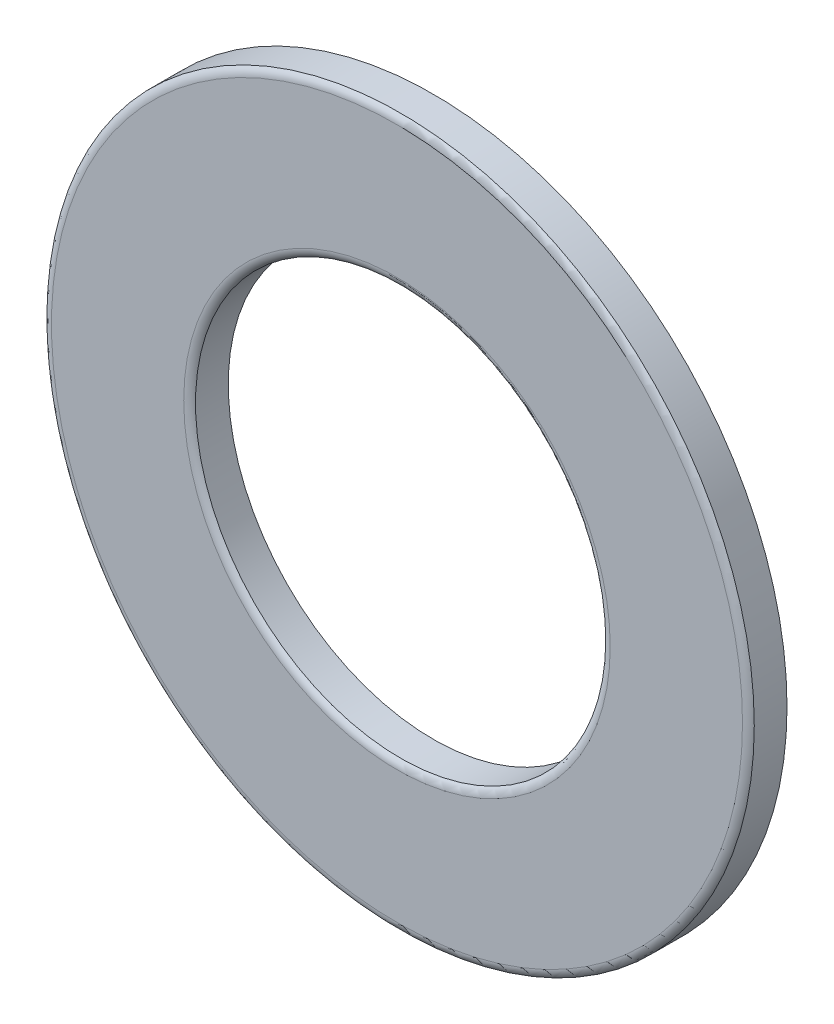
ISO-10303-21;
HEADER;
FILE_DESCRIPTION(('STEP AP214'),'2;1');
FILE_NAME('part.step','',(''),(''),'','','');
FILE_SCHEMA(('AUTOMOTIVE_DESIGN { 1 0 10303 214 1 1 1 1 }'));
ENDSEC;
DATA;
#1=APPLICATION_CONTEXT('core data for automotive mechanical design processes');
#2=APPLICATION_PROTOCOL_DEFINITION('international standard','automotive_design',2000,#1);
#3=PRODUCT_CONTEXT('',#1,'mechanical');
#4=PRODUCT('Part','Part','',(#3));
#5=PRODUCT_RELATED_PRODUCT_CATEGORY('part','',(#4));
#6=PRODUCT_DEFINITION_FORMATION('','',#4);
#7=PRODUCT_DEFINITION_CONTEXT('part definition',#1,'design');
#8=PRODUCT_DEFINITION('design','',#6,#7);
#9=PRODUCT_DEFINITION_SHAPE('','',#8);
#10=(LENGTH_UNIT() NAMED_UNIT(*) SI_UNIT(.MILLI.,.METRE.));
#11=(NAMED_UNIT(*) PLANE_ANGLE_UNIT() SI_UNIT($,.RADIAN.));
#12=(NAMED_UNIT(*) SI_UNIT($,.STERADIAN.) SOLID_ANGLE_UNIT());
#13=UNCERTAINTY_MEASURE_WITH_UNIT(LENGTH_MEASURE(1.E-05),#10,'distance_accuracy_value','');
#14=(GEOMETRIC_REPRESENTATION_CONTEXT(3) GLOBAL_UNCERTAINTY_ASSIGNED_CONTEXT((#13)) GLOBAL_UNIT_ASSIGNED_CONTEXT((#10,
#11,#12)) REPRESENTATION_CONTEXT('',''));
#15=CARTESIAN_POINT('',(0.,0.,0.));
#16=DIRECTION('',(0.,0.,1.));
#17=DIRECTION('',(1.,0.,0.));
#18=AXIS2_PLACEMENT_3D('',#15,#16,#17);
#19=CARTESIAN_POINT('',(0.,0.,1.143));
#20=DIRECTION('',(0.,0.,1.));
#21=DIRECTION('',(1.,0.,0.));
#22=AXIS2_PLACEMENT_3D('',#19,#20,#21);
#23=PLANE('',#22);
#24=CARTESIAN_POINT('',(0.,0.,1.143));
#25=DIRECTION('',(0.,0.,1.));
#26=DIRECTION('',(1.,0.,0.));
#27=AXIS2_PLACEMENT_3D('',#24,#25,#26);
#28=CIRCLE('',#27,13.4016651396564);
#29=CARTESIAN_POINT('',(13.4016651396564,0.,1.143));
#30=VERTEX_POINT('',#29);
#31=EDGE_CURVE('E10',#30,#30,#28,.F.);
#32=ORIENTED_EDGE('',*,*,#31,.T.);
#33=EDGE_LOOP('',(#32));
#34=FACE_BOUND('',#33,.T.);
#35=CARTESIAN_POINT('',(0.,0.,1.143));
#36=DIRECTION('',(0.,0.,1.));
#37=DIRECTION('',(1.,0.,0.));
#38=AXIS2_PLACEMENT_3D('',#35,#36,#37);
#39=CIRCLE('',#38,21.7138348603435);
#40=CARTESIAN_POINT('',(21.7138348603435,0.,1.143));
#41=VERTEX_POINT('',#40);
#42=EDGE_CURVE('E44',#41,#41,#39,.T.);
#43=ORIENTED_EDGE('',*,*,#42,.T.);
#44=EDGE_LOOP('',(#43));
#45=FACE_BOUND('',#44,.T.);
#46=ADVANCED_FACE('F37',(#34,#45),#23,.T.);
#47=CARTESIAN_POINT('',(0.,0.,-1.143));
#48=DIRECTION('',(0.,0.,1.));
#49=DIRECTION('',(1.,0.,0.));
#50=AXIS2_PLACEMENT_3D('',#47,#48,#49);
#51=PLANE('',#50);
#52=CARTESIAN_POINT('',(0.,0.,-1.143));
#53=DIRECTION('',(0.,0.,1.));
#54=DIRECTION('',(1.,0.,0.));
#55=AXIS2_PLACEMENT_3D('',#52,#53,#54);
#56=CIRCLE('',#55,22.225);
#57=CARTESIAN_POINT('',(22.225,0.,-1.143));
#58=VERTEX_POINT('',#57);
#59=EDGE_CURVE('E57',#58,#58,#56,.T.);
#60=ORIENTED_EDGE('',*,*,#59,.F.);
#61=EDGE_LOOP('',(#60));
#62=FACE_BOUND('',#61,.T.);
#63=CARTESIAN_POINT('',(0.,0.,-1.143));
#64=DIRECTION('',(0.,0.,1.));
#65=DIRECTION('',(1.,0.,0.));
#66=AXIS2_PLACEMENT_3D('',#63,#64,#65);
#67=CIRCLE('',#66,12.8905);
#68=CARTESIAN_POINT('',(12.8905,0.,-1.143));
#69=VERTEX_POINT('',#68);
#70=EDGE_CURVE('E60',#69,#69,#67,.T.);
#71=ORIENTED_EDGE('',*,*,#70,.T.);
#72=EDGE_LOOP('',(#71));
#73=FACE_BOUND('',#72,.T.);
#74=ADVANCED_FACE('F64',(#62,#73),#51,.F.);
#75=CARTESIAN_POINT('',(0.,0.,1.143));
#76=DIRECTION('',(0.,0.,-1.));
#77=DIRECTION('',(-1.,0.,0.));
#78=AXIS2_PLACEMENT_3D('',#75,#76,#77);
#79=CYLINDRICAL_SURFACE('',#78,22.225);
#80=CARTESIAN_POINT('',(0.,0.,0.914399999999984));
#81=DIRECTION('',(0.,0.,1.));
#82=DIRECTION('',(1.,0.,0.));
#83=AXIS2_PLACEMENT_3D('',#80,#81,#82);
#84=CIRCLE('',#83,22.225);
#85=CARTESIAN_POINT('',(22.225,0.,0.914399999999984));
#86=VERTEX_POINT('',#85);
#87=EDGE_CURVE('E52',#86,#86,#84,.F.);
#88=ORIENTED_EDGE('',*,*,#87,.T.);
#89=EDGE_LOOP('',(#88));
#90=FACE_BOUND('',#89,.T.);
#91=ORIENTED_EDGE('',*,*,#59,.T.);
#92=EDGE_LOOP('',(#91));
#93=FACE_BOUND('',#92,.T.);
#94=ADVANCED_FACE('F69',(#90,#93),#79,.T.);
#95=CARTESIAN_POINT('',(0.,0.,1.143));
#96=DIRECTION('',(0.,0.,-1.));
#97=DIRECTION('',(-1.,0.,0.));
#98=AXIS2_PLACEMENT_3D('',#95,#96,#97);
#99=CYLINDRICAL_SURFACE('',#98,12.8905);
#100=CARTESIAN_POINT('',(0.,0.,0.914400000000002));
#101=DIRECTION('',(0.,0.,1.));
#102=DIRECTION('',(1.,0.,0.));
#103=AXIS2_PLACEMENT_3D('',#100,#101,#102);
#104=CIRCLE('',#103,12.8905);
#105=CARTESIAN_POINT('',(12.8905,0.,0.914400000000002));
#106=VERTEX_POINT('',#105);
#107=EDGE_CURVE('E48',#106,#106,#104,.T.);
#108=ORIENTED_EDGE('',*,*,#107,.T.);
#109=EDGE_LOOP('',(#108));
#110=FACE_BOUND('',#109,.T.);
#111=ORIENTED_EDGE('',*,*,#70,.F.);
#112=EDGE_LOOP('',(#111));
#113=FACE_BOUND('',#112,.T.);
#114=ADVANCED_FACE('F66',(#110,#113),#99,.F.);
#115=CARTESIAN_POINT('',(0.,0.,0.457200000000001));
#116=DIRECTION('',(0.,0.,1.));
#117=DIRECTION('',(1.,0.,0.));
#118=AXIS2_PLACEMENT_3D('',#115,#116,#117);
#119=TOROIDAL_SURFACE('',#118,13.4016651396564,0.6858);
#120=ORIENTED_EDGE('',*,*,#107,.F.);
#121=EDGE_LOOP('',(#120));
#122=FACE_BOUND('',#121,.T.);
#123=ORIENTED_EDGE('',*,*,#31,.F.);
#124=EDGE_LOOP('',(#123));
#125=FACE_BOUND('',#124,.T.);
#126=ADVANCED_FACE('F68',(#122,#125),#119,.T.);
#127=CARTESIAN_POINT('',(0.,0.,0.457200000000001));
#128=DIRECTION('',(0.,0.,-1.));
#129=DIRECTION('',(-1.,0.,0.));
#130=AXIS2_PLACEMENT_3D('',#127,#128,#129);
#131=TOROIDAL_SURFACE('',#130,21.7138348603435,0.6858);
#132=ORIENTED_EDGE('',*,*,#87,.F.);
#133=EDGE_LOOP('',(#132));
#134=FACE_BOUND('',#133,.T.);
#135=ORIENTED_EDGE('',*,*,#42,.F.);
#136=EDGE_LOOP('',(#135));
#137=FACE_BOUND('',#136,.T.);
#138=ADVANCED_FACE('F39',(#134,#137),#131,.T.);
#139=CLOSED_SHELL('',(#46,#74,#94,#114,#126,#138));
#140=MANIFOLD_SOLID_BREP('B2',#139);
#141=ADVANCED_BREP_SHAPE_REPRESENTATION('',(#18,#140),#14);
#142=SHAPE_DEFINITION_REPRESENTATION(#9,#141);
ENDSEC;
END-ISO-10303-21;
